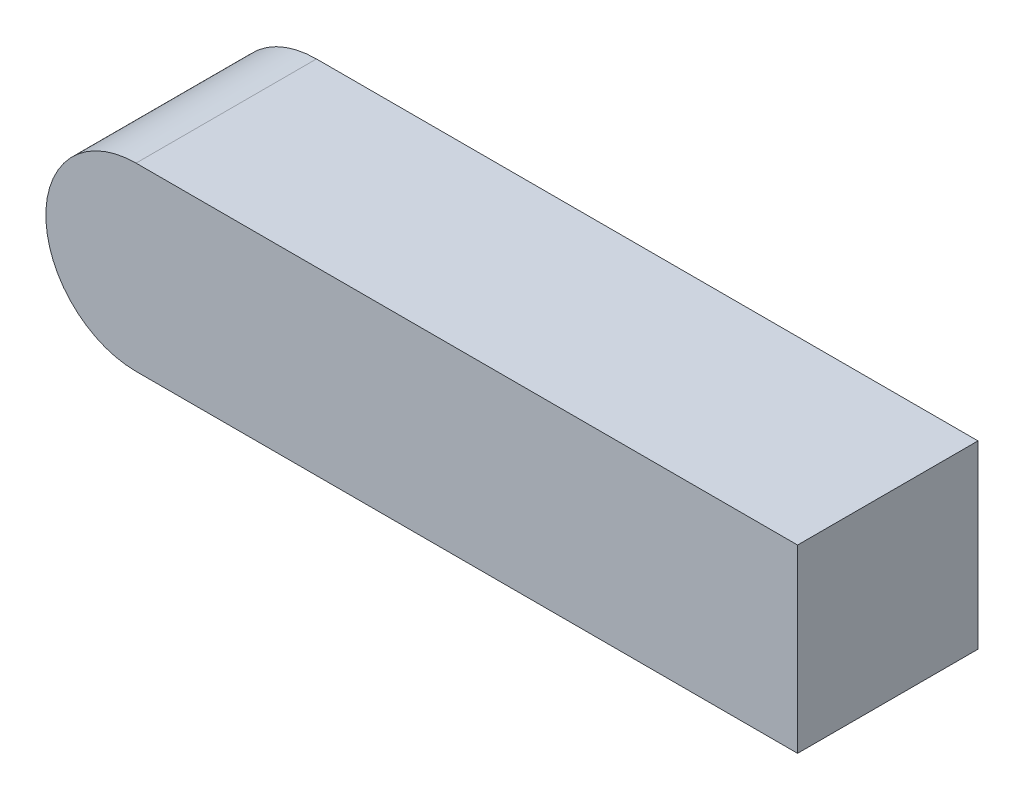
ISO-10303-21;
HEADER;
FILE_DESCRIPTION(('STEP AP214'),'2;1');
FILE_NAME('part.step','',(''),(''),'','','');
FILE_SCHEMA(('AUTOMOTIVE_DESIGN { 1 0 10303 214 1 1 1 1 }'));
ENDSEC;
DATA;
#1=APPLICATION_CONTEXT('core data for automotive mechanical design processes');
#2=APPLICATION_PROTOCOL_DEFINITION('international standard','automotive_design',2000,#1);
#3=PRODUCT_CONTEXT('',#1,'mechanical');
#4=PRODUCT('Part','Part','',(#3));
#5=PRODUCT_RELATED_PRODUCT_CATEGORY('part','',(#4));
#6=PRODUCT_DEFINITION_FORMATION('','',#4);
#7=PRODUCT_DEFINITION_CONTEXT('part definition',#1,'design');
#8=PRODUCT_DEFINITION('design','',#6,#7);
#9=PRODUCT_DEFINITION_SHAPE('','',#8);
#10=(LENGTH_UNIT() NAMED_UNIT(*) SI_UNIT(.MILLI.,.METRE.));
#11=(NAMED_UNIT(*) PLANE_ANGLE_UNIT() SI_UNIT($,.RADIAN.));
#12=(NAMED_UNIT(*) SI_UNIT($,.STERADIAN.) SOLID_ANGLE_UNIT());
#13=UNCERTAINTY_MEASURE_WITH_UNIT(LENGTH_MEASURE(1.E-05),#10,'distance_accuracy_value','');
#14=(GEOMETRIC_REPRESENTATION_CONTEXT(3) GLOBAL_UNCERTAINTY_ASSIGNED_CONTEXT((#13)) GLOBAL_UNIT_ASSIGNED_CONTEXT((#10,
#11,#12)) REPRESENTATION_CONTEXT('',''));
#15=CARTESIAN_POINT('',(0.,0.,0.));
#16=DIRECTION('',(0.,0.,1.));
#17=DIRECTION('',(1.,0.,0.));
#18=AXIS2_PLACEMENT_3D('',#15,#16,#17);
#19=CARTESIAN_POINT('',(-22.,0.,6.));
#20=DIRECTION('',(0.,0.,-1.));
#21=DIRECTION('',(-1.,0.,0.));
#22=AXIS2_PLACEMENT_3D('',#19,#20,#21);
#23=CYLINDRICAL_SURFACE('',#22,3.);
#24=CARTESIAN_POINT('',(-22.,0.,0.));
#25=DIRECTION('',(0.,0.,1.));
#26=DIRECTION('',(-1.,0.,0.));
#27=AXIS2_PLACEMENT_3D('',#24,#25,#26);
#28=CIRCLE('',#27,3.);
#29=CARTESIAN_POINT('',(-22.,3.,0.));
#30=VERTEX_POINT('',#29);
#31=CARTESIAN_POINT('',(-22.,-3.,0.));
#32=VERTEX_POINT('',#31);
#33=EDGE_CURVE('E97',#30,#32,#28,.T.);
#34=ORIENTED_EDGE('',*,*,#33,.T.);
#35=DIRECTION('',(0.,0.,-1.));
#36=VECTOR('',#35,1.);
#37=CARTESIAN_POINT('',(-22.,-3.,6.));
#38=LINE('',#37,#36);
#39=CARTESIAN_POINT('',(-22.,-3.,6.));
#40=VERTEX_POINT('',#39);
#41=EDGE_CURVE('E11',#40,#32,#38,.T.);
#42=ORIENTED_EDGE('',*,*,#41,.F.);
#43=CARTESIAN_POINT('',(-22.,0.,6.));
#44=DIRECTION('',(0.,0.,1.));
#45=DIRECTION('',(-1.,0.,0.));
#46=AXIS2_PLACEMENT_3D('',#43,#44,#45);
#47=CIRCLE('',#46,3.);
#48=CARTESIAN_POINT('',(-22.,3.,6.));
#49=VERTEX_POINT('',#48);
#50=EDGE_CURVE('E85',#49,#40,#47,.T.);
#51=ORIENTED_EDGE('',*,*,#50,.F.);
#52=DIRECTION('',(0.,0.,-1.));
#53=VECTOR('',#52,1.);
#54=CARTESIAN_POINT('',(-22.,3.,6.));
#55=LINE('',#54,#53);
#56=EDGE_CURVE('E93',#49,#30,#55,.T.);
#57=ORIENTED_EDGE('',*,*,#56,.T.);
#58=EDGE_LOOP('',(#34,#42,#51,#57));
#59=FACE_BOUND('',#58,.T.);
#60=ADVANCED_FACE('F34',(#59),#23,.T.);
#61=CARTESIAN_POINT('',(-22.,-3.,6.));
#62=DIRECTION('',(0.,1.,0.));
#63=DIRECTION('',(0.,0.,1.));
#64=AXIS2_PLACEMENT_3D('',#61,#62,#63);
#65=PLANE('',#64);
#66=DIRECTION('',(1.,0.,0.));
#67=VECTOR('',#66,1.);
#68=CARTESIAN_POINT('',(-22.,-3.,0.));
#69=LINE('',#68,#67);
#70=CARTESIAN_POINT('',(0.,-3.,0.));
#71=VERTEX_POINT('',#70);
#72=EDGE_CURVE('E89',#32,#71,#69,.T.);
#73=ORIENTED_EDGE('',*,*,#72,.T.);
#74=DIRECTION('',(0.,0.,-1.));
#75=VECTOR('',#74,1.);
#76=CARTESIAN_POINT('',(0.,-3.,6.));
#77=LINE('',#76,#75);
#78=CARTESIAN_POINT('',(0.,-3.,6.));
#79=VERTEX_POINT('',#78);
#80=EDGE_CURVE('E42',#79,#71,#77,.T.);
#81=ORIENTED_EDGE('',*,*,#80,.F.);
#82=DIRECTION('',(1.,0.,0.));
#83=VECTOR('',#82,1.);
#84=CARTESIAN_POINT('',(-22.,-3.,6.));
#85=LINE('',#84,#83);
#86=EDGE_CURVE('E80',#40,#79,#85,.T.);
#87=ORIENTED_EDGE('',*,*,#86,.F.);
#88=ORIENTED_EDGE('',*,*,#41,.T.);
#89=EDGE_LOOP('',(#73,#81,#87,#88));
#90=FACE_BOUND('',#89,.T.);
#91=ADVANCED_FACE('F88',(#90),#65,.F.);
#92=CARTESIAN_POINT('',(0.,3.,6.));
#93=DIRECTION('',(-1.,0.,0.));
#94=DIRECTION('',(0.,0.,1.));
#95=AXIS2_PLACEMENT_3D('',#92,#93,#94);
#96=PLANE('',#95);
#97=DIRECTION('',(0.,1.,0.));
#98=VECTOR('',#97,1.);
#99=CARTESIAN_POINT('',(0.,3.,0.));
#100=LINE('',#99,#98);
#101=CARTESIAN_POINT('',(0.,3.,0.));
#102=VERTEX_POINT('',#101);
#103=EDGE_CURVE('E67',#71,#102,#100,.T.);
#104=ORIENTED_EDGE('',*,*,#103,.T.);
#105=DIRECTION('',(0.,0.,-1.));
#106=VECTOR('',#105,1.);
#107=CARTESIAN_POINT('',(0.,3.,6.));
#108=LINE('',#107,#106);
#109=CARTESIAN_POINT('',(0.,3.,6.));
#110=VERTEX_POINT('',#109);
#111=EDGE_CURVE('E90',#110,#102,#108,.T.);
#112=ORIENTED_EDGE('',*,*,#111,.F.);
#113=DIRECTION('',(0.,1.,0.));
#114=VECTOR('',#113,1.);
#115=CARTESIAN_POINT('',(0.,3.,6.));
#116=LINE('',#115,#114);
#117=EDGE_CURVE('E83',#79,#110,#116,.T.);
#118=ORIENTED_EDGE('',*,*,#117,.F.);
#119=ORIENTED_EDGE('',*,*,#80,.T.);
#120=EDGE_LOOP('',(#104,#112,#118,#119));
#121=FACE_BOUND('',#120,.T.);
#122=ADVANCED_FACE('F91',(#121),#96,.F.);
#123=CARTESIAN_POINT('',(-22.,3.,6.));
#124=DIRECTION('',(0.,-1.,0.));
#125=DIRECTION('',(0.,0.,-1.));
#126=AXIS2_PLACEMENT_3D('',#123,#124,#125);
#127=PLANE('',#126);
#128=DIRECTION('',(-1.,0.,0.));
#129=VECTOR('',#128,1.);
#130=CARTESIAN_POINT('',(-22.,3.,0.));
#131=LINE('',#130,#129);
#132=EDGE_CURVE('E73',#102,#30,#131,.T.);
#133=ORIENTED_EDGE('',*,*,#132,.T.);
#134=ORIENTED_EDGE('',*,*,#56,.F.);
#135=DIRECTION('',(-1.,0.,0.));
#136=VECTOR('',#135,1.);
#137=CARTESIAN_POINT('',(-22.,3.,6.));
#138=LINE('',#137,#136);
#139=EDGE_CURVE('E50',#110,#49,#138,.T.);
#140=ORIENTED_EDGE('',*,*,#139,.F.);
#141=ORIENTED_EDGE('',*,*,#111,.T.);
#142=EDGE_LOOP('',(#133,#134,#140,#141));
#143=FACE_BOUND('',#142,.T.);
#144=ADVANCED_FACE('F104',(#143),#127,.F.);
#145=CARTESIAN_POINT('',(-22.,0.,6.));
#146=DIRECTION('',(0.,0.,-1.));
#147=DIRECTION('',(-1.,0.,0.));
#148=AXIS2_PLACEMENT_3D('',#145,#146,#147);
#149=PLANE('',#148);
#150=ORIENTED_EDGE('',*,*,#50,.T.);
#151=ORIENTED_EDGE('',*,*,#86,.T.);
#152=ORIENTED_EDGE('',*,*,#117,.T.);
#153=ORIENTED_EDGE('',*,*,#139,.T.);
#154=EDGE_LOOP('',(#150,#151,#152,#153));
#155=FACE_BOUND('',#154,.T.);
#156=ADVANCED_FACE('F81',(#155),#149,.F.);
#157=CARTESIAN_POINT('',(-22.,0.,0.));
#158=DIRECTION('',(0.,0.,-1.));
#159=DIRECTION('',(-1.,0.,0.));
#160=AXIS2_PLACEMENT_3D('',#157,#158,#159);
#161=PLANE('',#160);
#162=ORIENTED_EDGE('',*,*,#33,.F.);
#163=ORIENTED_EDGE('',*,*,#132,.F.);
#164=ORIENTED_EDGE('',*,*,#103,.F.);
#165=ORIENTED_EDGE('',*,*,#72,.F.);
#166=EDGE_LOOP('',(#162,#163,#164,#165));
#167=FACE_BOUND('',#166,.T.);
#168=ADVANCED_FACE('F107',(#167),#161,.T.);
#169=CLOSED_SHELL('',(#60,#91,#122,#144,#156,#168));
#170=MANIFOLD_SOLID_BREP('B2',#169);
#171=ADVANCED_BREP_SHAPE_REPRESENTATION('',(#18,#170),#14);
#172=SHAPE_DEFINITION_REPRESENTATION(#9,#171);
ENDSEC;
END-ISO-10303-21;
